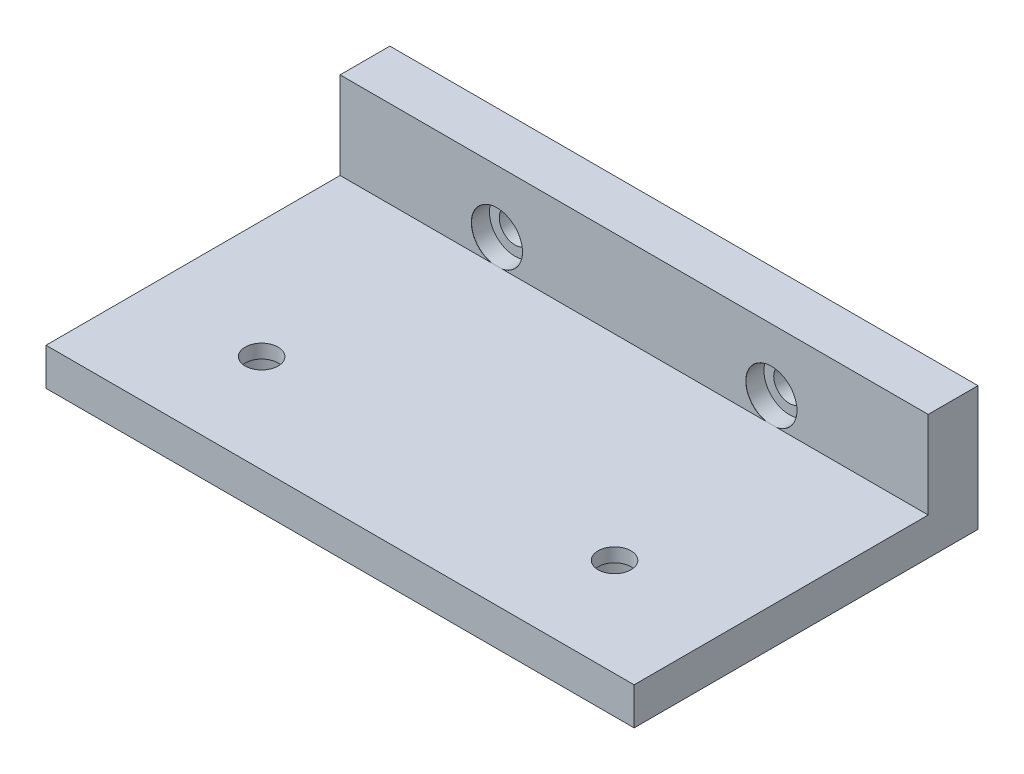
ISO-10303-21;
HEADER;
FILE_DESCRIPTION(('STEP AP214'),'2;1');
FILE_NAME('part.step','',(''),(''),'','','');
FILE_SCHEMA(('AUTOMOTIVE_DESIGN { 1 0 10303 214 1 1 1 1 }'));
ENDSEC;
DATA;
#1=APPLICATION_CONTEXT('core data for automotive mechanical design processes');
#2=APPLICATION_PROTOCOL_DEFINITION('international standard','automotive_design',2000,#1);
#3=PRODUCT_CONTEXT('',#1,'mechanical');
#4=PRODUCT('Part','Part','',(#3));
#5=PRODUCT_RELATED_PRODUCT_CATEGORY('part','',(#4));
#6=PRODUCT_DEFINITION_FORMATION('','',#4);
#7=PRODUCT_DEFINITION_CONTEXT('part definition',#1,'design');
#8=PRODUCT_DEFINITION('design','',#6,#7);
#9=PRODUCT_DEFINITION_SHAPE('','',#8);
#10=(LENGTH_UNIT() NAMED_UNIT(*) SI_UNIT(.MILLI.,.METRE.));
#11=(NAMED_UNIT(*) PLANE_ANGLE_UNIT() SI_UNIT($,.RADIAN.));
#12=(NAMED_UNIT(*) SI_UNIT($,.STERADIAN.) SOLID_ANGLE_UNIT());
#13=UNCERTAINTY_MEASURE_WITH_UNIT(LENGTH_MEASURE(1.E-05),#10,'distance_accuracy_value','');
#14=(GEOMETRIC_REPRESENTATION_CONTEXT(3) GLOBAL_UNCERTAINTY_ASSIGNED_CONTEXT((#13)) GLOBAL_UNIT_ASSIGNED_CONTEXT((#10,
#11,#12)) REPRESENTATION_CONTEXT('',''));
#15=CARTESIAN_POINT('',(0.,0.,0.));
#16=DIRECTION('',(0.,0.,1.));
#17=DIRECTION('',(1.,0.,0.));
#18=AXIS2_PLACEMENT_3D('',#15,#16,#17);
#19=CARTESIAN_POINT('',(-75.,-6.35000000000001,87.7));
#20=DIRECTION('',(0.,-1.,0.));
#21=DIRECTION('',(0.,0.,-1.));
#22=AXIS2_PLACEMENT_3D('',#19,#20,#21);
#23=PLANE('',#22);
#24=CARTESIAN_POINT('',(45.,-6.35000000000001,62.7));
#25=DIRECTION('',(0.,-1.,0.));
#26=DIRECTION('',(0.,0.,-1.));
#27=AXIS2_PLACEMENT_3D('',#24,#25,#26);
#28=CIRCLE('',#27,4.2);
#29=CARTESIAN_POINT('',(45.,-6.35000000000001,58.5));
#30=VERTEX_POINT('',#29);
#31=EDGE_CURVE('E122',#30,#30,#28,.F.);
#32=ORIENTED_EDGE('',*,*,#31,.F.);
#33=EDGE_LOOP('',(#32));
#34=FACE_BOUND('',#33,.T.);
#35=DIRECTION('',(-1.,0.,0.));
#36=VECTOR('',#35,1.);
#37=CARTESIAN_POINT('',(-75.,-6.35000000000001,12.7));
#38=LINE('',#37,#36);
#39=CARTESIAN_POINT('',(75.,-6.35000000000001,12.7));
#40=VERTEX_POINT('',#39);
#41=CARTESIAN_POINT('',(36.5010413052278,-6.35000000000001,12.7));
#42=VERTEX_POINT('',#41);
#43=EDGE_CURVE('E126',#40,#42,#38,.T.);
#44=ORIENTED_EDGE('',*,*,#43,.T.);
#45=CARTESIAN_POINT('',(33.4989586947722,-6.35000000000001,12.7));
#46=VERTEX_POINT('',#45);
#47=EDGE_CURVE('E125',#42,#46,#38,.T.);
#48=ORIENTED_EDGE('',*,*,#47,.T.);
#49=CARTESIAN_POINT('',(-33.4989586947723,-6.35000000000001,12.7));
#50=VERTEX_POINT('',#49);
#51=EDGE_CURVE('E106',#46,#50,#38,.T.);
#52=ORIENTED_EDGE('',*,*,#51,.T.);
#53=CARTESIAN_POINT('',(-36.5010413052277,-6.35000000000001,12.7));
#54=VERTEX_POINT('',#53);
#55=EDGE_CURVE('E102',#50,#54,#38,.T.);
#56=ORIENTED_EDGE('',*,*,#55,.T.);
#57=CARTESIAN_POINT('',(-75.,-6.35000000000001,12.7));
#58=VERTEX_POINT('',#57);
#59=EDGE_CURVE('E107',#54,#58,#38,.T.);
#60=ORIENTED_EDGE('',*,*,#59,.T.);
#61=DIRECTION('',(0.,0.,-1.));
#62=VECTOR('',#61,1.);
#63=CARTESIAN_POINT('',(-75.,-6.35000000000001,87.7));
#64=LINE('',#63,#62);
#65=CARTESIAN_POINT('',(-75.,-6.35000000000001,87.7));
#66=VERTEX_POINT('',#65);
#67=EDGE_CURVE('E132',#66,#58,#64,.T.);
#68=ORIENTED_EDGE('',*,*,#67,.F.);
#69=DIRECTION('',(-1.,0.,0.));
#70=VECTOR('',#69,1.);
#71=CARTESIAN_POINT('',(-75.,-6.35000000000001,87.7));
#72=LINE('',#71,#70);
#73=CARTESIAN_POINT('',(75.,-6.35000000000001,87.7));
#74=VERTEX_POINT('',#73);
#75=EDGE_CURVE('E130',#74,#66,#72,.T.);
#76=ORIENTED_EDGE('',*,*,#75,.F.);
#77=DIRECTION('',(0.,0.,-1.));
#78=VECTOR('',#77,1.);
#79=CARTESIAN_POINT('',(75.,-6.35000000000001,87.7));
#80=LINE('',#79,#78);
#81=EDGE_CURVE('E135',#74,#40,#80,.T.);
#82=ORIENTED_EDGE('',*,*,#81,.T.);
#83=EDGE_LOOP('',(#44,#48,#52,#56,#60,#68,#76,#82));
#84=FACE_BOUND('',#83,.T.);
#85=CARTESIAN_POINT('',(-45.,-6.35000000000001,62.7));
#86=DIRECTION('',(0.,-1.,0.));
#87=DIRECTION('',(0.,0.,-1.));
#88=AXIS2_PLACEMENT_3D('',#85,#86,#87);
#89=CIRCLE('',#88,4.2);
#90=CARTESIAN_POINT('',(-45.,-6.35000000000001,58.5));
#91=VERTEX_POINT('',#90);
#92=EDGE_CURVE('E224',#91,#91,#89,.F.);
#93=ORIENTED_EDGE('',*,*,#92,.F.);
#94=EDGE_LOOP('',(#93));
#95=FACE_BOUND('',#94,.T.);
#96=ADVANCED_FACE('F37',(#34,#84,#95),#23,.F.);
#97=CARTESIAN_POINT('',(-75.,-15.875,12.7));
#98=DIRECTION('',(1.,0.,0.));
#99=DIRECTION('',(0.,0.,-1.));
#100=AXIS2_PLACEMENT_3D('',#97,#98,#99);
#101=PLANE('',#100);
#102=DIRECTION('',(0.,-1.,0.));
#103=VECTOR('',#102,1.);
#104=CARTESIAN_POINT('',(-75.,-15.875,0.));
#105=LINE('',#104,#103);
#106=CARTESIAN_POINT('',(-75.,15.875,0.));
#107=VERTEX_POINT('',#106);
#108=CARTESIAN_POINT('',(-75.,-15.875,0.));
#109=VERTEX_POINT('',#108);
#110=EDGE_CURVE('E138',#107,#109,#105,.T.);
#111=ORIENTED_EDGE('',*,*,#110,.T.);
#112=DIRECTION('',(0.,0.,-1.));
#113=VECTOR('',#112,1.);
#114=CARTESIAN_POINT('',(-75.,-15.875,12.7));
#115=LINE('',#114,#113);
#116=CARTESIAN_POINT('',(-75.,-15.875,87.7));
#117=VERTEX_POINT('',#116);
#118=EDGE_CURVE('E11',#117,#109,#115,.T.);
#119=ORIENTED_EDGE('',*,*,#118,.F.);
#120=DIRECTION('',(0.,-1.,0.));
#121=VECTOR('',#120,1.);
#122=CARTESIAN_POINT('',(-75.,-15.875,87.7));
#123=LINE('',#122,#121);
#124=EDGE_CURVE('E129',#66,#117,#123,.T.);
#125=ORIENTED_EDGE('',*,*,#124,.F.);
#126=ORIENTED_EDGE('',*,*,#67,.T.);
#127=DIRECTION('',(0.,-1.,0.));
#128=VECTOR('',#127,1.);
#129=CARTESIAN_POINT('',(-75.,-15.875,12.7));
#130=LINE('',#129,#128);
#131=CARTESIAN_POINT('',(-75.,15.875,12.7));
#132=VERTEX_POINT('',#131);
#133=EDGE_CURVE('E139',#132,#58,#130,.T.);
#134=ORIENTED_EDGE('',*,*,#133,.F.);
#135=DIRECTION('',(0.,0.,-1.));
#136=VECTOR('',#135,1.);
#137=CARTESIAN_POINT('',(-75.,15.875,12.7));
#138=LINE('',#137,#136);
#139=EDGE_CURVE('E146',#132,#107,#138,.T.);
#140=ORIENTED_EDGE('',*,*,#139,.T.);
#141=EDGE_LOOP('',(#111,#119,#125,#126,#134,#140));
#142=FACE_BOUND('',#141,.T.);
#143=ADVANCED_FACE('F39',(#142),#101,.F.);
#144=CARTESIAN_POINT('',(75.,-15.875,12.7));
#145=DIRECTION('',(0.,1.,0.));
#146=DIRECTION('',(-1.,0.,0.));
#147=AXIS2_PLACEMENT_3D('',#144,#145,#146);
#148=PLANE('',#147);
#149=CARTESIAN_POINT('',(-45.,-15.875,62.7));
#150=DIRECTION('',(0.,-1.,0.));
#151=DIRECTION('',(0.,0.,-1.));
#152=AXIS2_PLACEMENT_3D('',#149,#150,#151);
#153=CIRCLE('',#152,9.025);
#154=CARTESIAN_POINT('',(-45.,-15.875,53.675));
#155=VERTEX_POINT('',#154);
#156=EDGE_CURVE('E236',#155,#155,#153,.T.);
#157=ORIENTED_EDGE('',*,*,#156,.F.);
#158=EDGE_LOOP('',(#157));
#159=FACE_BOUND('',#158,.T.);
#160=CARTESIAN_POINT('',(45.,-15.875,62.7));
#161=DIRECTION('',(0.,-1.,0.));
#162=DIRECTION('',(0.,0.,-1.));
#163=AXIS2_PLACEMENT_3D('',#160,#161,#162);
#164=CIRCLE('',#163,9.025);
#165=CARTESIAN_POINT('',(45.,-15.875,53.675));
#166=VERTEX_POINT('',#165);
#167=EDGE_CURVE('E221',#166,#166,#164,.T.);
#168=ORIENTED_EDGE('',*,*,#167,.F.);
#169=EDGE_LOOP('',(#168));
#170=FACE_BOUND('',#169,.T.);
#171=DIRECTION('',(1.,0.,0.));
#172=VECTOR('',#171,1.);
#173=CARTESIAN_POINT('',(75.,-15.875,0.));
#174=LINE('',#173,#172);
#175=CARTESIAN_POINT('',(75.,-15.875,0.));
#176=VERTEX_POINT('',#175);
#177=EDGE_CURVE('E149',#109,#176,#174,.T.);
#178=ORIENTED_EDGE('',*,*,#177,.T.);
#179=DIRECTION('',(0.,0.,-1.));
#180=VECTOR('',#179,1.);
#181=CARTESIAN_POINT('',(75.,-15.875,12.7));
#182=LINE('',#181,#180);
#183=CARTESIAN_POINT('',(75.,-15.875,87.7));
#184=VERTEX_POINT('',#183);
#185=EDGE_CURVE('E46',#184,#176,#182,.T.);
#186=ORIENTED_EDGE('',*,*,#185,.F.);
#187=DIRECTION('',(1.,0.,0.));
#188=VECTOR('',#187,1.);
#189=CARTESIAN_POINT('',(-75.,-15.875,87.7));
#190=LINE('',#189,#188);
#191=EDGE_CURVE('E182',#117,#184,#190,.T.);
#192=ORIENTED_EDGE('',*,*,#191,.F.);
#193=ORIENTED_EDGE('',*,*,#118,.T.);
#194=EDGE_LOOP('',(#178,#186,#192,#193));
#195=FACE_BOUND('',#194,.T.);
#196=ADVANCED_FACE('F197',(#159,#170,#195),#148,.F.);
#197=CARTESIAN_POINT('',(75.,-15.875,12.7));
#198=DIRECTION('',(-1.,0.,0.));
#199=DIRECTION('',(0.,0.,1.));
#200=AXIS2_PLACEMENT_3D('',#197,#198,#199);
#201=PLANE('',#200);
#202=DIRECTION('',(0.,1.,0.));
#203=VECTOR('',#202,1.);
#204=CARTESIAN_POINT('',(75.,-15.875,0.));
#205=LINE('',#204,#203);
#206=CARTESIAN_POINT('',(75.,15.875,0.));
#207=VERTEX_POINT('',#206);
#208=EDGE_CURVE('E151',#176,#207,#205,.T.);
#209=ORIENTED_EDGE('',*,*,#208,.T.);
#210=DIRECTION('',(0.,0.,-1.));
#211=VECTOR('',#210,1.);
#212=CARTESIAN_POINT('',(75.,15.875,12.7));
#213=LINE('',#212,#211);
#214=CARTESIAN_POINT('',(75.,15.875,12.7));
#215=VERTEX_POINT('',#214);
#216=EDGE_CURVE('E156',#215,#207,#213,.T.);
#217=ORIENTED_EDGE('',*,*,#216,.F.);
#218=DIRECTION('',(0.,1.,0.));
#219=VECTOR('',#218,1.);
#220=CARTESIAN_POINT('',(75.,-15.875,12.7));
#221=LINE('',#220,#219);
#222=EDGE_CURVE('E141',#40,#215,#221,.T.);
#223=ORIENTED_EDGE('',*,*,#222,.F.);
#224=ORIENTED_EDGE('',*,*,#81,.F.);
#225=DIRECTION('',(0.,1.,0.));
#226=VECTOR('',#225,1.);
#227=CARTESIAN_POINT('',(75.,-15.875,87.7));
#228=LINE('',#227,#226);
#229=EDGE_CURVE('E184',#184,#74,#228,.T.);
#230=ORIENTED_EDGE('',*,*,#229,.F.);
#231=ORIENTED_EDGE('',*,*,#185,.T.);
#232=EDGE_LOOP('',(#209,#217,#223,#224,#230,#231));
#233=FACE_BOUND('',#232,.T.);
#234=ADVANCED_FACE('F199',(#233),#201,.F.);
#235=CARTESIAN_POINT('',(75.,15.875,12.7));
#236=DIRECTION('',(0.,-1.,0.));
#237=DIRECTION('',(1.,0.,0.));
#238=AXIS2_PLACEMENT_3D('',#235,#236,#237);
#239=PLANE('',#238);
#240=DIRECTION('',(-1.,0.,0.));
#241=VECTOR('',#240,1.);
#242=CARTESIAN_POINT('',(75.,15.875,0.));
#243=LINE('',#242,#241);
#244=EDGE_CURVE('E142',#207,#107,#243,.T.);
#245=ORIENTED_EDGE('',*,*,#244,.T.);
#246=ORIENTED_EDGE('',*,*,#139,.F.);
#247=DIRECTION('',(-1.,0.,0.));
#248=VECTOR('',#247,1.);
#249=CARTESIAN_POINT('',(75.,15.875,12.7));
#250=LINE('',#249,#248);
#251=EDGE_CURVE('E144',#215,#132,#250,.T.);
#252=ORIENTED_EDGE('',*,*,#251,.F.);
#253=ORIENTED_EDGE('',*,*,#216,.T.);
#254=EDGE_LOOP('',(#245,#246,#252,#253));
#255=FACE_BOUND('',#254,.T.);
#256=ADVANCED_FACE('F257',(#255),#239,.F.);
#257=CARTESIAN_POINT('',(0.,0.,12.7));
#258=DIRECTION('',(0.,0.,1.));
#259=DIRECTION('',(1.,0.,0.));
#260=AXIS2_PLACEMENT_3D('',#257,#258,#259);
#261=PLANE('',#260);
#262=CARTESIAN_POINT('',(-35.,0.,12.7));
#263=DIRECTION('',(0.,0.,1.));
#264=DIRECTION('',(1.,0.,0.));
#265=AXIS2_PLACEMENT_3D('',#262,#263,#264);
#266=CIRCLE('',#265,6.525);
#267=EDGE_CURVE('E112',#50,#54,#266,.T.);
#268=ORIENTED_EDGE('',*,*,#267,.F.);
#269=ORIENTED_EDGE('',*,*,#51,.F.);
#270=CARTESIAN_POINT('',(35.,0.,12.7));
#271=DIRECTION('',(0.,0.,1.));
#272=DIRECTION('',(1.,0.,0.));
#273=AXIS2_PLACEMENT_3D('',#270,#271,#272);
#274=CIRCLE('',#273,6.525);
#275=EDGE_CURVE('E203',#42,#46,#274,.T.);
#276=ORIENTED_EDGE('',*,*,#275,.F.);
#277=ORIENTED_EDGE('',*,*,#43,.F.);
#278=ORIENTED_EDGE('',*,*,#222,.T.);
#279=ORIENTED_EDGE('',*,*,#251,.T.);
#280=ORIENTED_EDGE('',*,*,#133,.T.);
#281=ORIENTED_EDGE('',*,*,#59,.F.);
#282=EDGE_LOOP('',(#268,#269,#276,#277,#278,#279,#280,#281));
#283=FACE_BOUND('',#282,.T.);
#284=ADVANCED_FACE('F118',(#283),#261,.T.);
#285=CARTESIAN_POINT('',(0.,0.,0.));
#286=DIRECTION('',(0.,0.,1.));
#287=DIRECTION('',(1.,0.,0.));
#288=AXIS2_PLACEMENT_3D('',#285,#286,#287);
#289=PLANE('',#288);
#290=CARTESIAN_POINT('',(35.,0.,0.));
#291=DIRECTION('',(0.,0.,-1.));
#292=DIRECTION('',(-1.,0.,0.));
#293=AXIS2_PLACEMENT_3D('',#290,#291,#292);
#294=CIRCLE('',#293,4.00000000000001);
#295=CARTESIAN_POINT('',(31.,0.,0.));
#296=VERTEX_POINT('',#295);
#297=EDGE_CURVE('E167',#296,#296,#294,.T.);
#298=ORIENTED_EDGE('',*,*,#297,.F.);
#299=EDGE_LOOP('',(#298));
#300=FACE_BOUND('',#299,.T.);
#301=CARTESIAN_POINT('',(-35.,0.,0.));
#302=DIRECTION('',(0.,0.,-1.));
#303=DIRECTION('',(-1.,0.,0.));
#304=AXIS2_PLACEMENT_3D('',#301,#302,#303);
#305=CIRCLE('',#304,4.00000000000001);
#306=CARTESIAN_POINT('',(-39.,0.,0.));
#307=VERTEX_POINT('',#306);
#308=EDGE_CURVE('E162',#307,#307,#305,.T.);
#309=ORIENTED_EDGE('',*,*,#308,.F.);
#310=EDGE_LOOP('',(#309));
#311=FACE_BOUND('',#310,.T.);
#312=ORIENTED_EDGE('',*,*,#110,.F.);
#313=ORIENTED_EDGE('',*,*,#244,.F.);
#314=ORIENTED_EDGE('',*,*,#208,.F.);
#315=ORIENTED_EDGE('',*,*,#177,.F.);
#316=EDGE_LOOP('',(#312,#313,#314,#315));
#317=FACE_BOUND('',#316,.T.);
#318=ADVANCED_FACE('F256',(#300,#311,#317),#289,.F.);
#319=CARTESIAN_POINT('',(0.,0.,87.7));
#320=DIRECTION('',(0.,0.,-1.));
#321=DIRECTION('',(-1.,0.,0.));
#322=AXIS2_PLACEMENT_3D('',#319,#320,#321);
#323=PLANE('',#322);
#324=ORIENTED_EDGE('',*,*,#124,.T.);
#325=ORIENTED_EDGE('',*,*,#191,.T.);
#326=ORIENTED_EDGE('',*,*,#229,.T.);
#327=ORIENTED_EDGE('',*,*,#75,.T.);
#328=EDGE_LOOP('',(#324,#325,#326,#327));
#329=FACE_BOUND('',#328,.T.);
#330=ADVANCED_FACE('F190',(#329),#323,.F.);
#331=CARTESIAN_POINT('',(-35.,0.,87.7));
#332=DIRECTION('',(0.,0.,-1.));
#333=DIRECTION('',(-1.,0.,0.));
#334=AXIS2_PLACEMENT_3D('',#331,#332,#333);
#335=CYLINDRICAL_SURFACE('',#334,4.00000000000001);
#336=CARTESIAN_POINT('',(-35.,0.,8.1));
#337=DIRECTION('',(0.,0.,-1.));
#338=DIRECTION('',(-1.,0.,0.));
#339=AXIS2_PLACEMENT_3D('',#336,#337,#338);
#340=CIRCLE('',#339,4.00000000000001);
#341=CARTESIAN_POINT('',(-39.,0.,8.1));
#342=VERTEX_POINT('',#341);
#343=EDGE_CURVE('E41',#342,#342,#340,.F.);
#344=ORIENTED_EDGE('',*,*,#343,.T.);
#345=EDGE_LOOP('',(#344));
#346=FACE_BOUND('',#345,.T.);
#347=ORIENTED_EDGE('',*,*,#308,.T.);
#348=EDGE_LOOP('',(#347));
#349=FACE_BOUND('',#348,.T.);
#350=ADVANCED_FACE('F326',(#346,#349),#335,.F.);
#351=CARTESIAN_POINT('',(35.,0.,87.7));
#352=DIRECTION('',(0.,0.,-1.));
#353=DIRECTION('',(-1.,0.,0.));
#354=AXIS2_PLACEMENT_3D('',#351,#352,#353);
#355=CYLINDRICAL_SURFACE('',#354,4.00000000000001);
#356=CARTESIAN_POINT('',(35.,0.,8.1));
#357=DIRECTION('',(0.,0.,-1.));
#358=DIRECTION('',(-1.,0.,0.));
#359=AXIS2_PLACEMENT_3D('',#356,#357,#358);
#360=CIRCLE('',#359,4.00000000000001);
#361=CARTESIAN_POINT('',(31.,0.,8.1));
#362=VERTEX_POINT('',#361);
#363=EDGE_CURVE('E160',#362,#362,#360,.F.);
#364=ORIENTED_EDGE('',*,*,#363,.T.);
#365=EDGE_LOOP('',(#364));
#366=FACE_BOUND('',#365,.T.);
#367=ORIENTED_EDGE('',*,*,#297,.T.);
#368=EDGE_LOOP('',(#367));
#369=FACE_BOUND('',#368,.T.);
#370=ADVANCED_FACE('F324',(#366,#369),#355,.F.);
#371=CARTESIAN_POINT('',(41.525,0.,12.7));
#372=DIRECTION('',(0.,0.,1.));
#373=DIRECTION('',(1.,0.,0.));
#374=AXIS2_PLACEMENT_3D('',#371,#372,#373);
#375=PLANE('',#374);
#376=EDGE_CURVE('E60',#46,#42,#274,.T.);
#377=ORIENTED_EDGE('',*,*,#376,.F.);
#378=ORIENTED_EDGE('',*,*,#47,.F.);
#379=EDGE_LOOP('',(#377,#378));
#380=FACE_BOUND('',#379,.T.);
#381=ADVANCED_FACE('F321',(#380),#375,.F.);
#382=CARTESIAN_POINT('',(41.5,0.,8.1));
#383=DIRECTION('',(0.,0.,-1.));
#384=DIRECTION('',(-1.,0.,0.));
#385=AXIS2_PLACEMENT_3D('',#382,#383,#384);
#386=PLANE('',#385);
#387=CARTESIAN_POINT('',(35.,0.,8.1));
#388=DIRECTION('',(0.,0.,1.));
#389=DIRECTION('',(1.,0.,0.));
#390=AXIS2_PLACEMENT_3D('',#387,#388,#389);
#391=CIRCLE('',#390,6.5);
#392=CARTESIAN_POINT('',(41.5,0.,8.1));
#393=VERTEX_POINT('',#392);
#394=EDGE_CURVE('E163',#393,#393,#391,.T.);
#395=ORIENTED_EDGE('',*,*,#394,.T.);
#396=EDGE_LOOP('',(#395));
#397=FACE_BOUND('',#396,.T.);
#398=ORIENTED_EDGE('',*,*,#363,.F.);
#399=EDGE_LOOP('',(#398));
#400=FACE_BOUND('',#399,.T.);
#401=ADVANCED_FACE('F317',(#397,#400),#386,.F.);
#402=CARTESIAN_POINT('',(35.,0.,12.7));
#403=DIRECTION('',(0.,0.,1.));
#404=DIRECTION('',(1.,0.,0.));
#405=AXIS2_PLACEMENT_3D('',#402,#403,#404);
#406=CYLINDRICAL_SURFACE('',#405,6.5);
#407=ORIENTED_EDGE('',*,*,#394,.F.);
#408=EDGE_LOOP('',(#407));
#409=FACE_BOUND('',#408,.T.);
#410=CARTESIAN_POINT('',(35.,0.,12.675));
#411=DIRECTION('',(0.,0.,1.));
#412=DIRECTION('',(1.,0.,0.));
#413=AXIS2_PLACEMENT_3D('',#410,#411,#412);
#414=CIRCLE('',#413,6.5);
#415=CARTESIAN_POINT('',(41.5,0.,12.675));
#416=VERTEX_POINT('',#415);
#417=EDGE_CURVE('E170',#416,#416,#414,.T.);
#418=ORIENTED_EDGE('',*,*,#417,.T.);
#419=EDGE_LOOP('',(#418));
#420=FACE_BOUND('',#419,.T.);
#421=ADVANCED_FACE('F313',(#409,#420),#406,.F.);
#422=CARTESIAN_POINT('',(35.,0.,12.7));
#423=DIRECTION('',(0.,0.,1.));
#424=DIRECTION('',(1.,0.,0.));
#425=AXIS2_PLACEMENT_3D('',#422,#423,#424);
#426=CONICAL_SURFACE('',#425,6.525,0.785398163397518);
#427=ORIENTED_EDGE('',*,*,#417,.F.);
#428=EDGE_LOOP('',(#427));
#429=FACE_BOUND('',#428,.T.);
#430=ORIENTED_EDGE('',*,*,#376,.T.);
#431=ORIENTED_EDGE('',*,*,#275,.T.);
#432=EDGE_LOOP('',(#430,#431));
#433=FACE_BOUND('',#432,.T.);
#434=ADVANCED_FACE('F310',(#429,#433),#426,.F.);
#435=CARTESIAN_POINT('',(-28.475,0.,12.7));
#436=DIRECTION('',(0.,0.,1.));
#437=DIRECTION('',(1.,0.,0.));
#438=AXIS2_PLACEMENT_3D('',#435,#436,#437);
#439=PLANE('',#438);
#440=EDGE_CURVE('E53',#54,#50,#266,.T.);
#441=ORIENTED_EDGE('',*,*,#440,.F.);
#442=ORIENTED_EDGE('',*,*,#55,.F.);
#443=EDGE_LOOP('',(#441,#442));
#444=FACE_BOUND('',#443,.T.);
#445=ADVANCED_FACE('F103',(#444),#439,.F.);
#446=CARTESIAN_POINT('',(-28.5,0.,8.1));
#447=DIRECTION('',(0.,0.,-1.));
#448=DIRECTION('',(-1.,0.,0.));
#449=AXIS2_PLACEMENT_3D('',#446,#447,#448);
#450=PLANE('',#449);
#451=CARTESIAN_POINT('',(-35.,0.,8.1));
#452=DIRECTION('',(0.,0.,1.));
#453=DIRECTION('',(1.,0.,0.));
#454=AXIS2_PLACEMENT_3D('',#451,#452,#453);
#455=CIRCLE('',#454,6.5);
#456=CARTESIAN_POINT('',(-28.5,0.,8.1));
#457=VERTEX_POINT('',#456);
#458=EDGE_CURVE('E206',#457,#457,#455,.T.);
#459=ORIENTED_EDGE('',*,*,#458,.T.);
#460=EDGE_LOOP('',(#459));
#461=FACE_BOUND('',#460,.T.);
#462=ORIENTED_EDGE('',*,*,#343,.F.);
#463=EDGE_LOOP('',(#462));
#464=FACE_BOUND('',#463,.T.);
#465=ADVANCED_FACE('F303',(#461,#464),#450,.F.);
#466=CARTESIAN_POINT('',(-35.,0.,12.7));
#467=DIRECTION('',(0.,0.,1.));
#468=DIRECTION('',(1.,0.,0.));
#469=AXIS2_PLACEMENT_3D('',#466,#467,#468);
#470=CYLINDRICAL_SURFACE('',#469,6.5);
#471=ORIENTED_EDGE('',*,*,#458,.F.);
#472=EDGE_LOOP('',(#471));
#473=FACE_BOUND('',#472,.T.);
#474=CARTESIAN_POINT('',(-35.,0.,12.675));
#475=DIRECTION('',(0.,0.,1.));
#476=DIRECTION('',(1.,0.,0.));
#477=AXIS2_PLACEMENT_3D('',#474,#475,#476);
#478=CIRCLE('',#477,6.5);
#479=CARTESIAN_POINT('',(-28.5,0.,12.675));
#480=VERTEX_POINT('',#479);
#481=EDGE_CURVE('E114',#480,#480,#478,.T.);
#482=ORIENTED_EDGE('',*,*,#481,.T.);
#483=EDGE_LOOP('',(#482));
#484=FACE_BOUND('',#483,.T.);
#485=ADVANCED_FACE('F299',(#473,#484),#470,.F.);
#486=CARTESIAN_POINT('',(-35.,0.,12.7));
#487=DIRECTION('',(0.,0.,1.));
#488=DIRECTION('',(1.,0.,0.));
#489=AXIS2_PLACEMENT_3D('',#486,#487,#488);
#490=CONICAL_SURFACE('',#489,6.525,0.785398163397448);
#491=ORIENTED_EDGE('',*,*,#481,.F.);
#492=EDGE_LOOP('',(#491));
#493=FACE_BOUND('',#492,.T.);
#494=ORIENTED_EDGE('',*,*,#440,.T.);
#495=ORIENTED_EDGE('',*,*,#267,.T.);
#496=EDGE_LOOP('',(#494,#495));
#497=FACE_BOUND('',#496,.T.);
#498=ADVANCED_FACE('F111',(#493,#497),#490,.F.);
#499=CARTESIAN_POINT('',(45.,-15.875,62.7));
#500=DIRECTION('',(0.,-1.,0.));
#501=DIRECTION('',(0.,0.,-1.));
#502=AXIS2_PLACEMENT_3D('',#499,#500,#501);
#503=CYLINDRICAL_SURFACE('',#502,4.2);
#504=ORIENTED_EDGE('',*,*,#31,.T.);
#505=EDGE_LOOP('',(#504));
#506=FACE_BOUND('',#505,.T.);
#507=CARTESIAN_POINT('',(45.,-9.87499999999999,62.7));
#508=DIRECTION('',(0.,-1.,0.));
#509=DIRECTION('',(0.,0.,-1.));
#510=AXIS2_PLACEMENT_3D('',#507,#508,#509);
#511=CIRCLE('',#510,4.2);
#512=CARTESIAN_POINT('',(45.,-9.87499999999999,58.5));
#513=VERTEX_POINT('',#512);
#514=EDGE_CURVE('E212',#513,#513,#511,.T.);
#515=ORIENTED_EDGE('',*,*,#514,.T.);
#516=EDGE_LOOP('',(#515));
#517=FACE_BOUND('',#516,.T.);
#518=ADVANCED_FACE('F292',(#506,#517),#503,.F.);
#519=CARTESIAN_POINT('',(49.2,-9.87499999999999,62.7));
#520=DIRECTION('',(0.,1.,0.));
#521=DIRECTION('',(0.,0.,1.));
#522=AXIS2_PLACEMENT_3D('',#519,#520,#521);
#523=PLANE('',#522);
#524=ORIENTED_EDGE('',*,*,#514,.F.);
#525=EDGE_LOOP('',(#524));
#526=FACE_BOUND('',#525,.T.);
#527=CARTESIAN_POINT('',(45.,-9.87499999999999,62.7));
#528=DIRECTION('',(0.,-1.,0.));
#529=DIRECTION('',(0.,0.,-1.));
#530=AXIS2_PLACEMENT_3D('',#527,#528,#529);
#531=CIRCLE('',#530,9.);
#532=CARTESIAN_POINT('',(45.,-9.87499999999999,53.7));
#533=VERTEX_POINT('',#532);
#534=EDGE_CURVE('E215',#533,#533,#531,.T.);
#535=ORIENTED_EDGE('',*,*,#534,.T.);
#536=EDGE_LOOP('',(#535));
#537=FACE_BOUND('',#536,.T.);
#538=ADVANCED_FACE('F284',(#526,#537),#523,.F.);
#539=CARTESIAN_POINT('',(45.,-15.875,62.7));
#540=DIRECTION('',(0.,-1.,0.));
#541=DIRECTION('',(0.,0.,-1.));
#542=AXIS2_PLACEMENT_3D('',#539,#540,#541);
#543=CYLINDRICAL_SURFACE('',#542,9.);
#544=ORIENTED_EDGE('',*,*,#534,.F.);
#545=EDGE_LOOP('',(#544));
#546=FACE_BOUND('',#545,.T.);
#547=CARTESIAN_POINT('',(45.,-15.85,62.7));
#548=DIRECTION('',(0.,-1.,0.));
#549=DIRECTION('',(0.,0.,-1.));
#550=AXIS2_PLACEMENT_3D('',#547,#548,#549);
#551=CIRCLE('',#550,9.);
#552=CARTESIAN_POINT('',(45.,-15.85,53.7));
#553=VERTEX_POINT('',#552);
#554=EDGE_CURVE('E218',#553,#553,#551,.T.);
#555=ORIENTED_EDGE('',*,*,#554,.T.);
#556=EDGE_LOOP('',(#555));
#557=FACE_BOUND('',#556,.T.);
#558=ADVANCED_FACE('F275',(#546,#557),#543,.F.);
#559=CARTESIAN_POINT('',(45.,-15.875,62.7));
#560=DIRECTION('',(0.,-1.,0.));
#561=DIRECTION('',(0.,0.,-1.));
#562=AXIS2_PLACEMENT_3D('',#559,#560,#561);
#563=CONICAL_SURFACE('',#562,9.025,0.785398163397448);
#564=ORIENTED_EDGE('',*,*,#554,.F.);
#565=EDGE_LOOP('',(#564));
#566=FACE_BOUND('',#565,.T.);
#567=ORIENTED_EDGE('',*,*,#167,.T.);
#568=EDGE_LOOP('',(#567));
#569=FACE_BOUND('',#568,.T.);
#570=ADVANCED_FACE('F273',(#566,#569),#563,.F.);
#571=CARTESIAN_POINT('',(-45.,-15.875,62.7));
#572=DIRECTION('',(0.,-1.,0.));
#573=DIRECTION('',(0.,0.,-1.));
#574=AXIS2_PLACEMENT_3D('',#571,#572,#573);
#575=CYLINDRICAL_SURFACE('',#574,4.2);
#576=ORIENTED_EDGE('',*,*,#92,.T.);
#577=EDGE_LOOP('',(#576));
#578=FACE_BOUND('',#577,.T.);
#579=CARTESIAN_POINT('',(-45.,-9.875,62.7));
#580=DIRECTION('',(0.,-1.,0.));
#581=DIRECTION('',(0.,0.,-1.));
#582=AXIS2_PLACEMENT_3D('',#579,#580,#581);
#583=CIRCLE('',#582,4.2);
#584=CARTESIAN_POINT('',(-45.,-9.875,58.5));
#585=VERTEX_POINT('',#584);
#586=EDGE_CURVE('E227',#585,#585,#583,.T.);
#587=ORIENTED_EDGE('',*,*,#586,.T.);
#588=EDGE_LOOP('',(#587));
#589=FACE_BOUND('',#588,.T.);
#590=ADVANCED_FACE('F242',(#578,#589),#575,.F.);
#591=CARTESIAN_POINT('',(-40.8,-9.875,62.7));
#592=DIRECTION('',(0.,1.,0.));
#593=DIRECTION('',(0.,0.,1.));
#594=AXIS2_PLACEMENT_3D('',#591,#592,#593);
#595=PLANE('',#594);
#596=ORIENTED_EDGE('',*,*,#586,.F.);
#597=EDGE_LOOP('',(#596));
#598=FACE_BOUND('',#597,.T.);
#599=CARTESIAN_POINT('',(-45.,-9.875,62.7));
#600=DIRECTION('',(0.,-1.,0.));
#601=DIRECTION('',(0.,0.,-1.));
#602=AXIS2_PLACEMENT_3D('',#599,#600,#601);
#603=CIRCLE('',#602,9.);
#604=CARTESIAN_POINT('',(-45.,-9.875,53.7));
#605=VERTEX_POINT('',#604);
#606=EDGE_CURVE('E230',#605,#605,#603,.T.);
#607=ORIENTED_EDGE('',*,*,#606,.T.);
#608=EDGE_LOOP('',(#607));
#609=FACE_BOUND('',#608,.T.);
#610=ADVANCED_FACE('F282',(#598,#609),#595,.F.);
#611=CARTESIAN_POINT('',(-45.,-15.875,62.7));
#612=DIRECTION('',(0.,-1.,0.));
#613=DIRECTION('',(0.,0.,-1.));
#614=AXIS2_PLACEMENT_3D('',#611,#612,#613);
#615=CYLINDRICAL_SURFACE('',#614,9.);
#616=ORIENTED_EDGE('',*,*,#606,.F.);
#617=EDGE_LOOP('',(#616));
#618=FACE_BOUND('',#617,.T.);
#619=CARTESIAN_POINT('',(-45.,-15.85,62.7));
#620=DIRECTION('',(0.,-1.,0.));
#621=DIRECTION('',(0.,0.,-1.));
#622=AXIS2_PLACEMENT_3D('',#619,#620,#621);
#623=CIRCLE('',#622,9.);
#624=CARTESIAN_POINT('',(-45.,-15.85,53.7));
#625=VERTEX_POINT('',#624);
#626=EDGE_CURVE('E233',#625,#625,#623,.T.);
#627=ORIENTED_EDGE('',*,*,#626,.T.);
#628=EDGE_LOOP('',(#627));
#629=FACE_BOUND('',#628,.T.);
#630=ADVANCED_FACE('F418',(#618,#629),#615,.F.);
#631=CARTESIAN_POINT('',(-45.,-15.875,62.7));
#632=DIRECTION('',(0.,-1.,0.));
#633=DIRECTION('',(0.,0.,-1.));
#634=AXIS2_PLACEMENT_3D('',#631,#632,#633);
#635=CONICAL_SURFACE('',#634,9.025,0.785398163397448);
#636=ORIENTED_EDGE('',*,*,#626,.F.);
#637=EDGE_LOOP('',(#636));
#638=FACE_BOUND('',#637,.T.);
#639=ORIENTED_EDGE('',*,*,#156,.T.);
#640=EDGE_LOOP('',(#639));
#641=FACE_BOUND('',#640,.T.);
#642=ADVANCED_FACE('F427',(#638,#641),#635,.F.);
#643=CLOSED_SHELL('',(#96,#143,#196,#234,#256,#284,#318,#330,#350,#370,#381,#401,#421,#434,#445,
#465,#485,#498,#518,#538,#558,#570,#590,#610,#630,#642));
#644=MANIFOLD_SOLID_BREP('B2',#643);
#645=ADVANCED_BREP_SHAPE_REPRESENTATION('',(#18,#644),#14);
#646=SHAPE_DEFINITION_REPRESENTATION(#9,#645);
ENDSEC;
END-ISO-10303-21;
